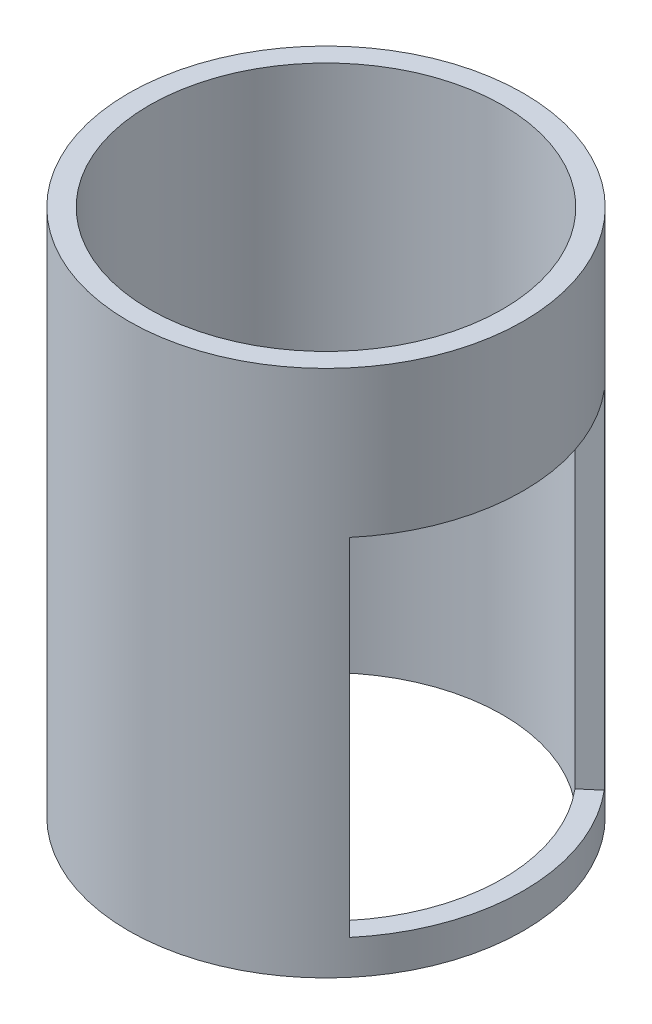
ISO-10303-21;
HEADER;
FILE_DESCRIPTION(('STEP AP214'),'2;1');
FILE_NAME('part.step','',(''),(''),'','','');
FILE_SCHEMA(('AUTOMOTIVE_DESIGN { 1 0 10303 214 1 1 1 1 }'));
ENDSEC;
DATA;
#1=APPLICATION_CONTEXT('core data for automotive mechanical design processes');
#2=APPLICATION_PROTOCOL_DEFINITION('international standard','automotive_design',2000,#1);
#3=PRODUCT_CONTEXT('',#1,'mechanical');
#4=PRODUCT('Part','Part','',(#3));
#5=PRODUCT_RELATED_PRODUCT_CATEGORY('part','',(#4));
#6=PRODUCT_DEFINITION_FORMATION('','',#4);
#7=PRODUCT_DEFINITION_CONTEXT('part definition',#1,'design');
#8=PRODUCT_DEFINITION('design','',#6,#7);
#9=PRODUCT_DEFINITION_SHAPE('','',#8);
#10=(LENGTH_UNIT() NAMED_UNIT(*) SI_UNIT(.MILLI.,.METRE.));
#11=(NAMED_UNIT(*) PLANE_ANGLE_UNIT() SI_UNIT($,.RADIAN.));
#12=(NAMED_UNIT(*) SI_UNIT($,.STERADIAN.) SOLID_ANGLE_UNIT());
#13=UNCERTAINTY_MEASURE_WITH_UNIT(LENGTH_MEASURE(1.E-05),#10,'distance_accuracy_value','');
#14=(GEOMETRIC_REPRESENTATION_CONTEXT(3) GLOBAL_UNCERTAINTY_ASSIGNED_CONTEXT((#13)) GLOBAL_UNIT_ASSIGNED_CONTEXT((#10,
#11,#12)) REPRESENTATION_CONTEXT('',''));
#15=CARTESIAN_POINT('',(0.,0.,0.));
#16=DIRECTION('',(0.,0.,1.));
#17=DIRECTION('',(1.,0.,0.));
#18=AXIS2_PLACEMENT_3D('',#15,#16,#17);
#19=CARTESIAN_POINT('',(0.,76.2,0.));
#20=DIRECTION('',(0.,1.,0.));
#21=DIRECTION('',(0.,0.,1.));
#22=AXIS2_PLACEMENT_3D('',#19,#20,#21);
#23=PLANE('',#22);
#24=CARTESIAN_POINT('',(0.,76.2,0.));
#25=DIRECTION('',(0.,1.,0.));
#26=DIRECTION('',(0.,0.,1.));
#27=AXIS2_PLACEMENT_3D('',#24,#25,#26);
#28=CIRCLE('',#27,57.);
#29=CARTESIAN_POINT('',(0.,76.2,57.));
#30=VERTEX_POINT('',#29);
#31=EDGE_CURVE('E123',#30,#30,#28,.T.);
#32=ORIENTED_EDGE('',*,*,#31,.T.);
#33=EDGE_LOOP('',(#32));
#34=FACE_BOUND('',#33,.T.);
#35=CARTESIAN_POINT('',(0.,76.2,0.));
#36=DIRECTION('',(0.,1.,0.));
#37=DIRECTION('',(0.,0.,1.));
#38=AXIS2_PLACEMENT_3D('',#35,#36,#37);
#39=CIRCLE('',#38,51.);
#40=CARTESIAN_POINT('',(0.,76.2,51.));
#41=VERTEX_POINT('',#40);
#42=EDGE_CURVE('E115',#41,#41,#39,.T.);
#43=ORIENTED_EDGE('',*,*,#42,.F.);
#44=EDGE_LOOP('',(#43));
#45=FACE_BOUND('',#44,.T.);
#46=ADVANCED_FACE('F38',(#34,#45),#23,.T.);
#47=CARTESIAN_POINT('',(0.,-76.2,0.));
#48=DIRECTION('',(0.,1.,0.));
#49=DIRECTION('',(0.,0.,1.));
#50=AXIS2_PLACEMENT_3D('',#47,#48,#49);
#51=PLANE('',#50);
#52=CARTESIAN_POINT('',(0.,-76.2,0.));
#53=DIRECTION('',(0.,1.,0.));
#54=DIRECTION('',(0.,0.,1.));
#55=AXIS2_PLACEMENT_3D('',#52,#53,#54);
#56=CIRCLE('',#55,57.);
#57=CARTESIAN_POINT('',(0.,-76.2,57.));
#58=VERTEX_POINT('',#57);
#59=EDGE_CURVE('E119',#58,#58,#56,.T.);
#60=ORIENTED_EDGE('',*,*,#59,.F.);
#61=EDGE_LOOP('',(#60));
#62=FACE_BOUND('',#61,.T.);
#63=CARTESIAN_POINT('',(0.,-76.2,0.));
#64=DIRECTION('',(0.,1.,0.));
#65=DIRECTION('',(0.,0.,1.));
#66=AXIS2_PLACEMENT_3D('',#63,#64,#65);
#67=CIRCLE('',#66,51.);
#68=CARTESIAN_POINT('',(0.,-76.2,51.));
#69=VERTEX_POINT('',#68);
#70=EDGE_CURVE('E113',#69,#69,#67,.T.);
#71=ORIENTED_EDGE('',*,*,#70,.T.);
#72=EDGE_LOOP('',(#71));
#73=FACE_BOUND('',#72,.T.);
#74=ADVANCED_FACE('F154',(#62,#73),#51,.F.);
#75=CARTESIAN_POINT('',(0.,76.2,0.));
#76=DIRECTION('',(0.,-1.,0.));
#77=DIRECTION('',(0.,0.,-1.));
#78=AXIS2_PLACEMENT_3D('',#75,#76,#77);
#79=CYLINDRICAL_SURFACE('',#78,57.);
#80=DIRECTION('',(0.,-1.,0.));
#81=VECTOR('',#80,1.);
#82=CARTESIAN_POINT('',(43.5315158481363,33.8,36.7968358417332));
#83=LINE('',#82,#81);
#84=CARTESIAN_POINT('',(43.5315158481363,33.8,36.7968358417332));
#85=VERTEX_POINT('',#84);
#86=CARTESIAN_POINT('',(43.5315158481363,-66.2,36.7968358417332));
#87=VERTEX_POINT('',#86);
#88=EDGE_CURVE('E95',#85,#87,#83,.T.);
#89=ORIENTED_EDGE('',*,*,#88,.F.);
#90=CARTESIAN_POINT('',(0.,33.8,0.));
#91=DIRECTION('',(0.,-1.,0.));
#92=DIRECTION('',(0.,0.,1.));
#93=AXIS2_PLACEMENT_3D('',#90,#91,#92);
#94=CIRCLE('',#93,57.);
#95=CARTESIAN_POINT('',(43.5315158481363,33.8,-36.7968358417331));
#96=VERTEX_POINT('',#95);
#97=EDGE_CURVE('E82',#96,#85,#94,.T.);
#98=ORIENTED_EDGE('',*,*,#97,.F.);
#99=DIRECTION('',(0.,-1.,0.));
#100=VECTOR('',#99,1.);
#101=CARTESIAN_POINT('',(43.5315158481363,33.8,-36.7968358417331));
#102=LINE('',#101,#100);
#103=CARTESIAN_POINT('',(43.5315158481363,-66.2,-36.7968358417331));
#104=VERTEX_POINT('',#103);
#105=EDGE_CURVE('E90',#96,#104,#102,.T.);
#106=ORIENTED_EDGE('',*,*,#105,.T.);
#107=CARTESIAN_POINT('',(0.,-66.2,0.));
#108=DIRECTION('',(0.,-1.,0.));
#109=DIRECTION('',(0.,0.,1.));
#110=AXIS2_PLACEMENT_3D('',#107,#108,#109);
#111=CIRCLE('',#110,57.);
#112=EDGE_CURVE('E107',#104,#87,#111,.T.);
#113=ORIENTED_EDGE('',*,*,#112,.T.);
#114=EDGE_LOOP('',(#89,#98,#106,#113));
#115=FACE_BOUND('',#114,.T.);
#116=ORIENTED_EDGE('',*,*,#31,.F.);
#117=EDGE_LOOP('',(#116));
#118=FACE_BOUND('',#117,.T.);
#119=ORIENTED_EDGE('',*,*,#59,.T.);
#120=EDGE_LOOP('',(#119));
#121=FACE_BOUND('',#120,.T.);
#122=ADVANCED_FACE('F40',(#115,#118,#121),#79,.T.);
#123=CARTESIAN_POINT('',(0.,76.2,0.));
#124=DIRECTION('',(0.,-1.,0.));
#125=DIRECTION('',(0.,0.,-1.));
#126=AXIS2_PLACEMENT_3D('',#123,#124,#125);
#127=CYLINDRICAL_SURFACE('',#126,51.);
#128=CARTESIAN_POINT('',(0.,33.8,0.));
#129=DIRECTION('',(0.,1.,0.));
#130=DIRECTION('',(0.,0.,1.));
#131=AXIS2_PLACEMENT_3D('',#128,#129,#130);
#132=CIRCLE('',#131,51.);
#133=CARTESIAN_POINT('',(38.9492510220167,33.8,32.9234847004981));
#134=VERTEX_POINT('',#133);
#135=CARTESIAN_POINT('',(38.9492510220167,33.8,-32.9234847004981));
#136=VERTEX_POINT('',#135);
#137=EDGE_CURVE('E11',#134,#136,#132,.T.);
#138=ORIENTED_EDGE('',*,*,#137,.F.);
#139=DIRECTION('',(0.,-1.,0.));
#140=VECTOR('',#139,1.);
#141=CARTESIAN_POINT('',(38.9492510220167,76.2,32.9234847004981));
#142=LINE('',#141,#140);
#143=CARTESIAN_POINT('',(38.9492510220167,-66.2,32.9234847004981));
#144=VERTEX_POINT('',#143);
#145=EDGE_CURVE('E134',#144,#134,#142,.F.);
#146=ORIENTED_EDGE('',*,*,#145,.F.);
#147=CARTESIAN_POINT('',(0.,-66.2,0.));
#148=DIRECTION('',(0.,1.,0.));
#149=DIRECTION('',(0.,0.,1.));
#150=AXIS2_PLACEMENT_3D('',#147,#148,#149);
#151=CIRCLE('',#150,51.);
#152=CARTESIAN_POINT('',(38.9492510220167,-66.2,-32.9234847004981));
#153=VERTEX_POINT('',#152);
#154=EDGE_CURVE('E127',#144,#153,#151,.T.);
#155=ORIENTED_EDGE('',*,*,#154,.T.);
#156=DIRECTION('',(0.,-1.,0.));
#157=VECTOR('',#156,1.);
#158=CARTESIAN_POINT('',(38.9492510220167,76.2,-32.9234847004981));
#159=LINE('',#158,#157);
#160=EDGE_CURVE('E47',#136,#153,#159,.T.);
#161=ORIENTED_EDGE('',*,*,#160,.F.);
#162=EDGE_LOOP('',(#138,#146,#155,#161));
#163=FACE_BOUND('',#162,.T.);
#164=ORIENTED_EDGE('',*,*,#42,.T.);
#165=EDGE_LOOP('',(#164));
#166=FACE_BOUND('',#165,.T.);
#167=ORIENTED_EDGE('',*,*,#70,.F.);
#168=EDGE_LOOP('',(#167));
#169=FACE_BOUND('',#168,.T.);
#170=ADVANCED_FACE('F139',(#163,#166,#169),#127,.F.);
#171=CARTESIAN_POINT('',(0.,33.8,0.));
#172=DIRECTION('',(-0.645558523539178,0.,-0.763710804353269));
#173=DIRECTION('',(-0.763710804353269,0.,0.645558523539178));
#174=AXIS2_PLACEMENT_3D('',#171,#172,#173);
#175=PLANE('',#174);
#176=ORIENTED_EDGE('',*,*,#160,.T.);
#177=DIRECTION('',(0.763710804353269,0.,-0.645558523539178));
#178=VECTOR('',#177,1.);
#179=CARTESIAN_POINT('',(0.,-66.2,0.));
#180=LINE('',#179,#178);
#181=EDGE_CURVE('E59',#153,#104,#180,.T.);
#182=ORIENTED_EDGE('',*,*,#181,.T.);
#183=ORIENTED_EDGE('',*,*,#105,.F.);
#184=DIRECTION('',(0.763710804353269,0.,-0.645558523539178));
#185=VECTOR('',#184,1.);
#186=CARTESIAN_POINT('',(0.,33.8,0.));
#187=LINE('',#186,#185);
#188=EDGE_CURVE('E77',#136,#96,#187,.T.);
#189=ORIENTED_EDGE('',*,*,#188,.F.);
#190=EDGE_LOOP('',(#176,#182,#183,#189));
#191=FACE_BOUND('',#190,.T.);
#192=ADVANCED_FACE('F91',(#191),#175,.F.);
#193=CARTESIAN_POINT('',(0.,33.8,0.));
#194=DIRECTION('',(-0.645558523539178,0.,0.763710804353269));
#195=DIRECTION('',(0.763710804353269,0.,0.645558523539178));
#196=AXIS2_PLACEMENT_3D('',#193,#194,#195);
#197=PLANE('',#196);
#198=ORIENTED_EDGE('',*,*,#145,.T.);
#199=DIRECTION('',(-0.763710804353269,0.,-0.645558523539178));
#200=VECTOR('',#199,1.);
#201=CARTESIAN_POINT('',(0.,33.8,0.));
#202=LINE('',#201,#200);
#203=EDGE_CURVE('E96',#85,#134,#202,.T.);
#204=ORIENTED_EDGE('',*,*,#203,.F.);
#205=ORIENTED_EDGE('',*,*,#88,.T.);
#206=DIRECTION('',(-0.763710804353269,0.,-0.645558523539178));
#207=VECTOR('',#206,1.);
#208=CARTESIAN_POINT('',(0.,-66.2,0.));
#209=LINE('',#208,#207);
#210=EDGE_CURVE('E54',#87,#144,#209,.T.);
#211=ORIENTED_EDGE('',*,*,#210,.T.);
#212=EDGE_LOOP('',(#198,#204,#205,#211));
#213=FACE_BOUND('',#212,.T.);
#214=ADVANCED_FACE('F143',(#213),#197,.F.);
#215=CARTESIAN_POINT('',(0.,33.8,0.));
#216=DIRECTION('',(0.,1.,0.));
#217=DIRECTION('',(0.,0.,1.));
#218=AXIS2_PLACEMENT_3D('',#215,#216,#217);
#219=PLANE('',#218);
#220=ORIENTED_EDGE('',*,*,#137,.T.);
#221=ORIENTED_EDGE('',*,*,#188,.T.);
#222=ORIENTED_EDGE('',*,*,#97,.T.);
#223=ORIENTED_EDGE('',*,*,#203,.T.);
#224=EDGE_LOOP('',(#220,#221,#222,#223));
#225=FACE_BOUND('',#224,.T.);
#226=ADVANCED_FACE('F79',(#225),#219,.F.);
#227=CARTESIAN_POINT('',(0.,-66.2,0.));
#228=DIRECTION('',(0.,1.,0.));
#229=DIRECTION('',(0.,0.,1.));
#230=AXIS2_PLACEMENT_3D('',#227,#228,#229);
#231=PLANE('',#230);
#232=ORIENTED_EDGE('',*,*,#210,.F.);
#233=ORIENTED_EDGE('',*,*,#112,.F.);
#234=ORIENTED_EDGE('',*,*,#181,.F.);
#235=ORIENTED_EDGE('',*,*,#154,.F.);
#236=EDGE_LOOP('',(#232,#233,#234,#235));
#237=FACE_BOUND('',#236,.T.);
#238=ADVANCED_FACE('F141',(#237),#231,.T.);
#239=CLOSED_SHELL('',(#46,#74,#122,#170,#192,#214,#226,#238));
#240=MANIFOLD_SOLID_BREP('B2',#239);
#241=ADVANCED_BREP_SHAPE_REPRESENTATION('',(#18,#240),#14);
#242=SHAPE_DEFINITION_REPRESENTATION(#9,#241);
ENDSEC;
END-ISO-10303-21;
